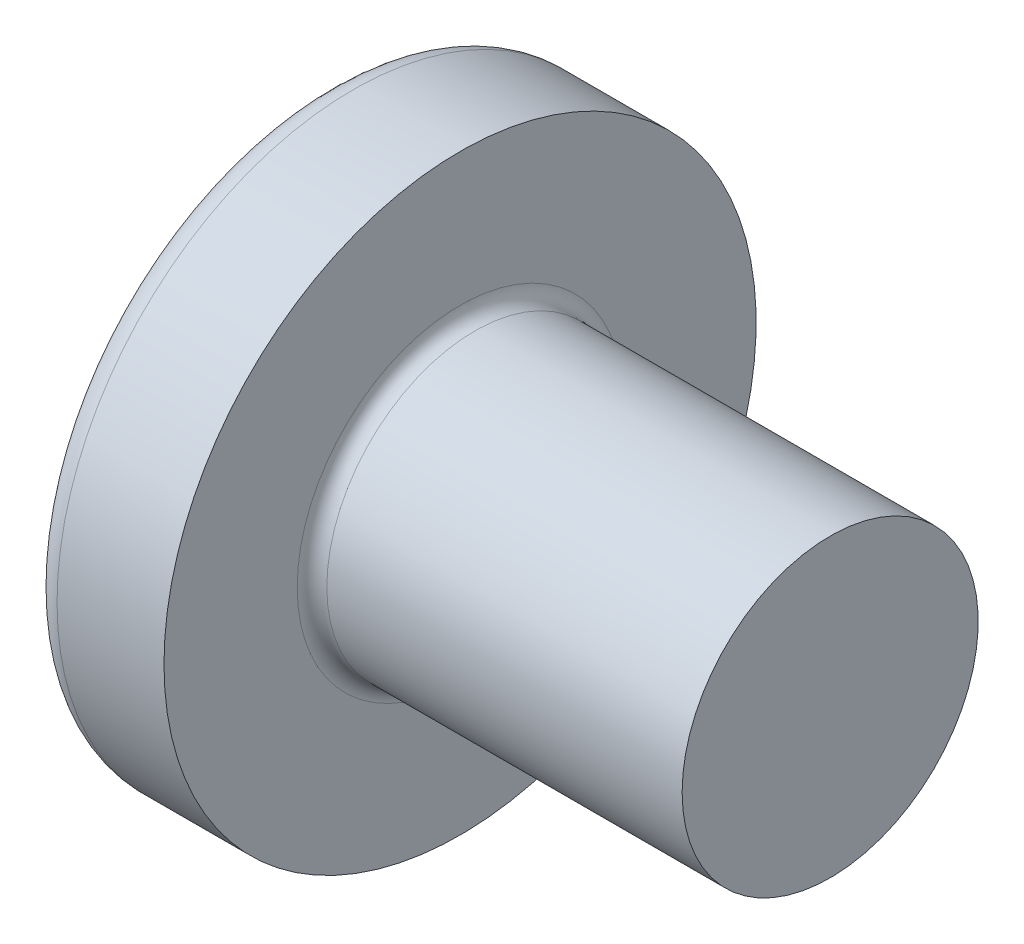
ISO-10303-21;
HEADER;
FILE_DESCRIPTION(('STEP AP214'),'2;1');
FILE_NAME('part.step','',(''),(''),'','','');
FILE_SCHEMA(('AUTOMOTIVE_DESIGN { 1 0 10303 214 1 1 1 1 }'));
ENDSEC;
DATA;
#1=APPLICATION_CONTEXT('core data for automotive mechanical design processes');
#2=APPLICATION_PROTOCOL_DEFINITION('international standard','automotive_design',2000,#1);
#3=PRODUCT_CONTEXT('',#1,'mechanical');
#4=PRODUCT('Part','Part','',(#3));
#5=PRODUCT_RELATED_PRODUCT_CATEGORY('part','',(#4));
#6=PRODUCT_DEFINITION_FORMATION('','',#4);
#7=PRODUCT_DEFINITION_CONTEXT('part definition',#1,'design');
#8=PRODUCT_DEFINITION('design','',#6,#7);
#9=PRODUCT_DEFINITION_SHAPE('','',#8);
#10=(LENGTH_UNIT() NAMED_UNIT(*) SI_UNIT(.MILLI.,.METRE.));
#11=(NAMED_UNIT(*) PLANE_ANGLE_UNIT() SI_UNIT($,.RADIAN.));
#12=(NAMED_UNIT(*) SI_UNIT($,.STERADIAN.) SOLID_ANGLE_UNIT());
#13=UNCERTAINTY_MEASURE_WITH_UNIT(LENGTH_MEASURE(1.E-05),#10,'distance_accuracy_value','');
#14=(GEOMETRIC_REPRESENTATION_CONTEXT(3) GLOBAL_UNCERTAINTY_ASSIGNED_CONTEXT((#13)) GLOBAL_UNIT_ASSIGNED_CONTEXT((#10,
#11,#12)) REPRESENTATION_CONTEXT('',''));
#15=CARTESIAN_POINT('',(0.,0.,0.));
#16=DIRECTION('',(0.,0.,1.));
#17=DIRECTION('',(1.,0.,0.));
#18=AXIS2_PLACEMENT_3D('',#15,#16,#17);
#19=CARTESIAN_POINT('',(13.,0.,0.));
#20=DIRECTION('',(-1.,0.,0.));
#21=DIRECTION('',(0.,1.,0.));
#22=AXIS2_PLACEMENT_3D('',#19,#20,#21);
#23=SPHERICAL_SURFACE('',#22,13.);
#24=CARTESIAN_POINT('',(2.53077790905606,0.,0.));
#25=DIRECTION('',(-1.,0.,0.));
#26=DIRECTION('',(0.,0.,1.));
#27=AXIS2_PLACEMENT_3D('',#24,#25,#26);
#28=CIRCLE('',#27,7.70684039087948);
#29=CARTESIAN_POINT('',(2.53077790905606,0.,7.70684039087948));
#30=VERTEX_POINT('',#29);
#31=EDGE_CURVE('E221',#30,#30,#28,.T.);
#32=ORIENTED_EDGE('',*,*,#31,.T.);
#33=EDGE_LOOP('',(#32));
#34=FACE_BOUND('',#33,.T.);
#35=CARTESIAN_POINT('',(0.192985393859263,0.,0.));
#36=DIRECTION('',(1.,0.,0.));
#37=DIRECTION('',(0.,0.,-1.));
#38=AXIS2_PLACEMENT_3D('',#35,#36,#37);
#39=CIRCLE('',#38,2.23167580040152);
#40=CARTESIAN_POINT('',(0.192985393859261,-1.07999999999999,-1.95294057208554));
#41=VERTEX_POINT('',#40);
#42=CARTESIAN_POINT('',(0.192985393859262,-1.95294057208555,-1.08));
#43=VERTEX_POINT('',#42);
#44=EDGE_CURVE('E348',#41,#43,#39,.F.);
#45=ORIENTED_EDGE('',*,*,#44,.F.);
#46=CARTESIAN_POINT('',(13.,-1.08,0.));
#47=DIRECTION('',(0.,1.,0.));
#48=DIRECTION('',(0.,0.,1.));
#49=AXIS2_PLACEMENT_3D('',#46,#47,#48);
#50=CIRCLE('',#49,12.9550607871982);
#51=CARTESIAN_POINT('',(0.695355040492038,-1.07999999999998,-4.0533088237211));
#52=VERTEX_POINT('',#51);
#53=EDGE_CURVE('E281',#52,#41,#50,.T.);
#54=ORIENTED_EDGE('',*,*,#53,.F.);
#55=CARTESIAN_POINT('',(12.1687962890756,0.,1.6671370072656));
#56=DIRECTION('',(0.446197753347441,0.,-0.89493439139844));
#57=DIRECTION('',(-0.89493439139844,0.,-0.446197753347441));
#58=AXIS2_PLACEMENT_3D('',#55,#56,#57);
#59=CIRCLE('',#58,12.8658367232742);
#60=CARTESIAN_POINT('',(0.695355040492038,1.08000000000001,-4.0533088237211));
#61=VERTEX_POINT('',#60);
#62=EDGE_CURVE('E255',#52,#61,#59,.T.);
#63=ORIENTED_EDGE('',*,*,#62,.T.);
#64=CARTESIAN_POINT('',(13.,1.08,0.));
#65=DIRECTION('',(0.,-1.,0.));
#66=DIRECTION('',(0.,0.,-1.));
#67=AXIS2_PLACEMENT_3D('',#64,#65,#66);
#68=CIRCLE('',#67,12.9550607871982);
#69=CARTESIAN_POINT('',(0.192985393859261,1.08000000000001,-1.95294057208553));
#70=VERTEX_POINT('',#69);
#71=EDGE_CURVE('E310',#70,#61,#68,.T.);
#72=ORIENTED_EDGE('',*,*,#71,.F.);
#73=CARTESIAN_POINT('',(0.192985393859262,1.95294057208555,-1.08));
#74=VERTEX_POINT('',#73);
#75=EDGE_CURVE('E363',#74,#70,#39,.F.);
#76=ORIENTED_EDGE('',*,*,#75,.F.);
#77=CARTESIAN_POINT('',(13.,0.,-1.08));
#78=DIRECTION('',(0.,0.,1.));
#79=DIRECTION('',(1.,0.,0.));
#80=AXIS2_PLACEMENT_3D('',#77,#78,#79);
#81=CIRCLE('',#80,12.9550607871982);
#82=CARTESIAN_POINT('',(0.695355040492042,4.05330882372111,-1.08));
#83=VERTEX_POINT('',#82);
#84=EDGE_CURVE('E249',#83,#74,#81,.T.);
#85=ORIENTED_EDGE('',*,*,#84,.F.);
#86=CARTESIAN_POINT('',(12.1687962890756,-1.66713700726547,0.));
#87=DIRECTION('',(0.446197753347431,0.894934391398445,0.));
#88=DIRECTION('',(-0.894934391398445,0.446197753347431,0.));
#89=AXIS2_PLACEMENT_3D('',#86,#87,#88);
#90=CIRCLE('',#89,12.8658367232742);
#91=CARTESIAN_POINT('',(0.695355040492042,4.05330882372111,1.08));
#92=VERTEX_POINT('',#91);
#93=EDGE_CURVE('E252',#83,#92,#90,.T.);
#94=ORIENTED_EDGE('',*,*,#93,.T.);
#95=CARTESIAN_POINT('',(13.,0.,1.08));
#96=DIRECTION('',(0.,0.,-1.));
#97=DIRECTION('',(0.,1.,0.));
#98=AXIS2_PLACEMENT_3D('',#95,#96,#97);
#99=CIRCLE('',#98,12.9550607871982);
#100=CARTESIAN_POINT('',(0.192985393859263,1.95294057208554,1.08));
#101=VERTEX_POINT('',#100);
#102=EDGE_CURVE('E245',#101,#92,#99,.T.);
#103=ORIENTED_EDGE('',*,*,#102,.F.);
#104=CARTESIAN_POINT('',(0.192985393859261,1.07999999999999,1.95294057208554));
#105=VERTEX_POINT('',#104);
#106=EDGE_CURVE('E362',#105,#101,#39,.F.);
#107=ORIENTED_EDGE('',*,*,#106,.F.);
#108=CARTESIAN_POINT('',(0.695355040492042,1.07999999999999,4.05330882372111));
#109=VERTEX_POINT('',#108);
#110=EDGE_CURVE('E265',#109,#105,#68,.T.);
#111=ORIENTED_EDGE('',*,*,#110,.F.);
#112=CARTESIAN_POINT('',(12.1687962890756,0.,-1.66713700726547));
#113=DIRECTION('',(0.446197753347431,0.,0.894934391398445));
#114=DIRECTION('',(0.894934391398445,0.,-0.446197753347431));
#115=AXIS2_PLACEMENT_3D('',#112,#113,#114);
#116=CIRCLE('',#115,12.8658367232742);
#117=CARTESIAN_POINT('',(0.695355040492042,-1.08000000000001,4.05330882372111));
#118=VERTEX_POINT('',#117);
#119=EDGE_CURVE('E55',#109,#118,#116,.T.);
#120=ORIENTED_EDGE('',*,*,#119,.T.);
#121=CARTESIAN_POINT('',(0.192985393859261,-1.08000000000001,1.95294057208553));
#122=VERTEX_POINT('',#121);
#123=EDGE_CURVE('E262',#122,#118,#50,.T.);
#124=ORIENTED_EDGE('',*,*,#123,.F.);
#125=CARTESIAN_POINT('',(0.192985393859263,-1.95294057208554,1.08));
#126=VERTEX_POINT('',#125);
#127=EDGE_CURVE('E398',#126,#122,#39,.F.);
#128=ORIENTED_EDGE('',*,*,#127,.F.);
#129=CARTESIAN_POINT('',(0.695355040492038,-4.0533088237211,1.08));
#130=VERTEX_POINT('',#129);
#131=EDGE_CURVE('E246',#130,#126,#99,.T.);
#132=ORIENTED_EDGE('',*,*,#131,.F.);
#133=CARTESIAN_POINT('',(12.1687962890756,1.6671370072656,0.));
#134=DIRECTION('',(0.446197753347441,-0.89493439139844,0.));
#135=DIRECTION('',(0.89493439139844,0.446197753347441,0.));
#136=AXIS2_PLACEMENT_3D('',#133,#134,#135);
#137=CIRCLE('',#136,12.8658367232742);
#138=CARTESIAN_POINT('',(0.695355040492038,-4.0533088237211,-1.08));
#139=VERTEX_POINT('',#138);
#140=EDGE_CURVE('E242',#130,#139,#137,.T.);
#141=ORIENTED_EDGE('',*,*,#140,.T.);
#142=EDGE_CURVE('E70',#43,#139,#81,.T.);
#143=ORIENTED_EDGE('',*,*,#142,.F.);
#144=EDGE_LOOP('',(#45,#54,#63,#72,#76,#85,#94,#103,#107,#111,#120,#124,#128,#132,#141,#143));
#145=FACE_BOUND('',#144,.T.);
#146=ADVANCED_FACE('F41',(#34,#145),#23,.T.);
#147=CARTESIAN_POINT('',(4.5,2.156383138963,-1.08));
#148=DIRECTION('',(0.,0.,1.));
#149=DIRECTION('',(1.,0.,0.));
#150=AXIS2_PLACEMENT_3D('',#147,#148,#149);
#151=PLANE('',#150);
#152=ORIENTED_EDGE('',*,*,#84,.T.);
#153=CARTESIAN_POINT('',(-3.43588792785571,2.23851936767459,-1.08));
#154=CARTESIAN_POINT('',(-2.7527913205408,2.18547211869447,-1.08));
#155=CARTESIAN_POINT('',(-2.06972018583939,2.13209339067246,-1.08));
#156=CARTESIAN_POINT('',(-0.703637932355171,2.02444570786586,-1.08));
#157=CARTESIAN_POINT('',(-0.0206268146116222,1.97017673990211,-1.08));
#158=CARTESIAN_POINT('',(1.34530575553301,1.86052289398031,-1.08));
#159=CARTESIAN_POINT('',(2.02822720797779,1.80513801656819,-1.08));
#160=CARTESIAN_POINT('',(3.05251420383416,1.72095758997849,-1.08));
#161=CARTESIAN_POINT('',(3.39392507761255,1.69271378676422,-1.08));
#162=CARTESIAN_POINT('',(4.07671251244001,1.63579565885855,-1.08));
#163=CARTESIAN_POINT('',(4.41808907331752,1.60712133211287,-1.08));
#164=CARTESIAN_POINT('',(5.47971211498772,1.51717277345393,-1.08));
#165=CARTESIAN_POINT('',(6.19988680931569,1.4550428860327,-1.08));
#166=CARTESIAN_POINT('',(7.27992860231561,1.3594298531641,-1.08));
#167=CARTESIAN_POINT('',(7.63990276767074,1.32715609306983,-1.08));
#168=CARTESIAN_POINT('',(8.35976072063592,1.26159920113472,-1.08));
#169=CARTESIAN_POINT('',(8.71964450791498,1.22831606565004,-1.08));
#170=CARTESIAN_POINT('',(9.43932436492648,1.16046898819133,-1.08));
#171=CARTESIAN_POINT('',(9.79912042388169,1.12590493148535,-1.08));
#172=CARTESIAN_POINT('',(10.5185446298634,1.05510254179503,-1.08));
#173=CARTESIAN_POINT('',(10.8781727785417,1.01886422564785,-1.08));
#174=CARTESIAN_POINT('',(11.5972182519752,0.944108377956584,-1.08));
#175=CARTESIAN_POINT('',(11.9566355614636,0.905590698029509,-1.08));
#176=CARTESIAN_POINT('',(12.4954907473183,0.845331334454827,-1.08));
#177=CARTESIAN_POINT('',(12.6750670374829,0.824830706169455,-1.08));
#178=CARTESIAN_POINT('',(13.0340978817974,0.782774474702269,-1.08));
#179=CARTESIAN_POINT('',(13.2135524345406,0.761218859534008,-1.08));
#180=CARTESIAN_POINT('',(13.3929293513437,0.739022214890856,-1.08));
#181=B_SPLINE_CURVE_WITH_KNOTS('',3,(#153,#154,#155,#156,#157,#158,#159,#160,#161,#162,#163,
#164,#165,#166,#167,#168,#169,#170,#171,#172,#173,#174,#175,#176,#177,#178,#179,#180),
.UNSPECIFIED.,.F.,.F.,(4,2,2,2,2,2,2,2,2,2,2,2,2,4),(0.,2.05546007613774,4.11095060892628,
6.16644013615303,7.19417128538829,8.22190734008792,10.3904503114318,11.4747033726806,
12.5589603485358,13.643314677002,14.7276581030614,15.8120721959877,16.3542975219795,
16.8965290100043),.UNSPECIFIED.);
#182=CARTESIAN_POINT('',(4.5,1.60013444747621,-1.08));
#183=VERTEX_POINT('',#182);
#184=EDGE_CURVE('E385',#74,#183,#181,.T.);
#185=ORIENTED_EDGE('',*,*,#184,.T.);
#186=DIRECTION('',(0.,1.,0.));
#187=VECTOR('',#186,1.);
#188=CARTESIAN_POINT('',(4.5,-2.15638313896293,-1.08));
#189=LINE('',#188,#187);
#190=CARTESIAN_POINT('',(4.5,2.156383138963,-1.08));
#191=VERTEX_POINT('',#190);
#192=EDGE_CURVE('E331',#183,#191,#189,.T.);
#193=ORIENTED_EDGE('',*,*,#192,.T.);
#194=DIRECTION('',(0.894934391398445,-0.446197753347431,0.));
#195=VECTOR('',#194,1.);
#196=CARTESIAN_POINT('',(0.,4.4,-1.08));
#197=LINE('',#196,#195);
#198=EDGE_CURVE('E222',#83,#191,#197,.T.);
#199=ORIENTED_EDGE('',*,*,#198,.F.);
#200=EDGE_LOOP('',(#152,#185,#193,#199));
#201=FACE_BOUND('',#200,.T.);
#202=ADVANCED_FACE('F176',(#201),#151,.T.);
#203=CARTESIAN_POINT('',(4.5,-2.15638313896293,-1.08));
#204=VERTEX_POINT('',#203);
#205=CARTESIAN_POINT('',(4.5,-1.60013444747621,-1.08));
#206=VERTEX_POINT('',#205);
#207=EDGE_CURVE('E230',#204,#206,#189,.T.);
#208=ORIENTED_EDGE('',*,*,#207,.T.);
#209=CARTESIAN_POINT('',(-3.43588792785571,-2.23851936767459,-1.08));
#210=CARTESIAN_POINT('',(-2.7527913205408,-2.18547211869447,-1.08));
#211=CARTESIAN_POINT('',(-2.06972018583939,-2.13209339067246,-1.08));
#212=CARTESIAN_POINT('',(-0.70363793235517,-2.02444570786586,-1.08));
#213=CARTESIAN_POINT('',(-0.0206268146116209,-1.97017673990211,-1.08));
#214=CARTESIAN_POINT('',(1.34530575553301,-1.86052289398031,-1.08));
#215=CARTESIAN_POINT('',(2.02822720797779,-1.80513801656819,-1.08));
#216=CARTESIAN_POINT('',(3.05251420383416,-1.72095758997849,-1.08));
#217=CARTESIAN_POINT('',(3.39392507761255,-1.69271378676422,-1.08));
#218=CARTESIAN_POINT('',(4.07671251244001,-1.63579565885855,-1.08));
#219=CARTESIAN_POINT('',(4.41808907331752,-1.60712133211287,-1.08));
#220=CARTESIAN_POINT('',(5.47971211498773,-1.51717277345393,-1.08));
#221=CARTESIAN_POINT('',(6.19988680931569,-1.4550428860327,-1.08));
#222=CARTESIAN_POINT('',(7.27992860231561,-1.3594298531641,-1.08));
#223=CARTESIAN_POINT('',(7.63990276767074,-1.32715609306983,-1.08));
#224=CARTESIAN_POINT('',(8.35976072063592,-1.26159920113472,-1.08));
#225=CARTESIAN_POINT('',(8.71964450791498,-1.22831606565004,-1.08));
#226=CARTESIAN_POINT('',(9.43932436492649,-1.16046898819133,-1.08));
#227=CARTESIAN_POINT('',(9.79912042388169,-1.12590493148535,-1.08));
#228=CARTESIAN_POINT('',(10.5185446298634,-1.05510254179503,-1.08));
#229=CARTESIAN_POINT('',(10.8781727785417,-1.01886422564785,-1.08));
#230=CARTESIAN_POINT('',(11.5972182519753,-0.944108377956583,-1.08));
#231=CARTESIAN_POINT('',(11.9566355614636,-0.905590698029509,-1.08));
#232=CARTESIAN_POINT('',(12.4954907473183,-0.845331334454827,-1.08));
#233=CARTESIAN_POINT('',(12.6750670374829,-0.824830706169454,-1.08));
#234=CARTESIAN_POINT('',(13.0340978817974,-0.782774474702268,-1.08));
#235=CARTESIAN_POINT('',(13.2135524345406,-0.761218859534007,-1.08));
#236=CARTESIAN_POINT('',(13.3929293513437,-0.739022214890855,-1.08));
#237=B_SPLINE_CURVE_WITH_KNOTS('',3,(#209,#210,#211,#212,#213,#214,#215,#216,#217,#218,#219,
#220,#221,#222,#223,#224,#225,#226,#227,#228,#229,#230,#231,#232,#233,#234,#235,#236),
.UNSPECIFIED.,.F.,.F.,(4,2,2,2,2,2,2,2,2,2,2,2,2,4),(0.,2.05546007613774,4.11095060892628,
6.16644013615303,7.19417128538829,8.22190734008792,10.3904503114318,11.4747033726806,
12.5589603485358,13.643314677002,14.7276581030614,15.8120721959877,16.3542975219795,
16.8965290100043),.UNSPECIFIED.);
#238=EDGE_CURVE('E361',#206,#43,#237,.F.);
#239=ORIENTED_EDGE('',*,*,#238,.T.);
#240=ORIENTED_EDGE('',*,*,#142,.T.);
#241=DIRECTION('',(0.89493439139844,0.446197753347441,0.));
#242=VECTOR('',#241,1.);
#243=CARTESIAN_POINT('',(0.,-4.4,-1.08));
#244=LINE('',#243,#242);
#245=EDGE_CURVE('E313',#139,#204,#244,.T.);
#246=ORIENTED_EDGE('',*,*,#245,.T.);
#247=EDGE_LOOP('',(#208,#239,#240,#246));
#248=FACE_BOUND('',#247,.T.);
#249=ADVANCED_FACE('F183',(#248),#151,.T.);
#250=CARTESIAN_POINT('',(4.5,-2.15638313896293,1.08));
#251=DIRECTION('',(0.,0.,-1.));
#252=DIRECTION('',(0.,1.,0.));
#253=AXIS2_PLACEMENT_3D('',#250,#251,#252);
#254=PLANE('',#253);
#255=DIRECTION('',(0.,-1.,0.));
#256=VECTOR('',#255,1.);
#257=CARTESIAN_POINT('',(4.5,2.156383138963,1.08));
#258=LINE('',#257,#256);
#259=CARTESIAN_POINT('',(4.5,2.156383138963,1.08));
#260=VERTEX_POINT('',#259);
#261=CARTESIAN_POINT('',(4.5,1.60013444747621,1.08));
#262=VERTEX_POINT('',#261);
#263=EDGE_CURVE('E321',#260,#262,#258,.T.);
#264=ORIENTED_EDGE('',*,*,#263,.T.);
#265=CARTESIAN_POINT('',(-3.43588792785571,2.23851936767459,1.08));
#266=CARTESIAN_POINT('',(-2.7527913205408,2.18547211869447,1.08));
#267=CARTESIAN_POINT('',(-2.06972018583939,2.13209339067246,1.08));
#268=CARTESIAN_POINT('',(-0.70363793235517,2.02444570786586,1.08));
#269=CARTESIAN_POINT('',(-0.0206268146116213,1.97017673990211,1.08));
#270=CARTESIAN_POINT('',(1.34530575553301,1.86052289398031,1.08));
#271=CARTESIAN_POINT('',(2.02822720797779,1.80513801656819,1.08));
#272=CARTESIAN_POINT('',(3.05251420383416,1.72095758997849,1.08));
#273=CARTESIAN_POINT('',(3.39392507761255,1.69271378676422,1.08));
#274=CARTESIAN_POINT('',(4.07671251244001,1.63579565885855,1.08));
#275=CARTESIAN_POINT('',(4.41808907331752,1.60712133211287,1.08));
#276=CARTESIAN_POINT('',(5.47971211498773,1.51717277345393,1.08));
#277=CARTESIAN_POINT('',(6.19988680931569,1.4550428860327,1.08));
#278=CARTESIAN_POINT('',(7.27992860231561,1.35942985316409,1.08));
#279=CARTESIAN_POINT('',(7.63990276767074,1.32715609306983,1.08));
#280=CARTESIAN_POINT('',(8.35976072063593,1.26159920113472,1.08));
#281=CARTESIAN_POINT('',(8.71964450791499,1.22831606565004,1.08));
#282=CARTESIAN_POINT('',(9.43932436492649,1.16046898819133,1.08));
#283=CARTESIAN_POINT('',(9.7991204238817,1.12590493148534,1.08));
#284=CARTESIAN_POINT('',(10.5185446298634,1.05510254179503,1.08));
#285=CARTESIAN_POINT('',(10.8781727785417,1.01886422564785,1.08));
#286=CARTESIAN_POINT('',(11.5972182519753,0.944108377956582,1.08));
#287=CARTESIAN_POINT('',(11.9566355614636,0.905590698029507,1.08));
#288=CARTESIAN_POINT('',(12.4954907473183,0.845331334454825,1.08));
#289=CARTESIAN_POINT('',(12.6750670374829,0.824830706169453,1.08));
#290=CARTESIAN_POINT('',(13.0340978817974,0.782774474702267,1.08));
#291=CARTESIAN_POINT('',(13.2135524345406,0.761218859534006,1.08));
#292=CARTESIAN_POINT('',(13.3929293513437,0.739022214890854,1.08));
#293=B_SPLINE_CURVE_WITH_KNOTS('',3,(#265,#266,#267,#268,#269,#270,#271,#272,#273,#274,#275,
#276,#277,#278,#279,#280,#281,#282,#283,#284,#285,#286,#287,#288,#289,#290,#291,#292),
.UNSPECIFIED.,.F.,.F.,(4,2,2,2,2,2,2,2,2,2,2,2,2,4),(0.,2.05546007613774,4.11095060892628,
6.16644013615303,7.19417128538829,8.22190734008792,10.3904503114318,11.4747033726806,
12.5589603485358,13.643314677002,14.7276581030614,15.8120721959877,16.3542975219795,
16.8965290100043),.UNSPECIFIED.);
#294=EDGE_CURVE('E286',#262,#101,#293,.F.);
#295=ORIENTED_EDGE('',*,*,#294,.T.);
#296=ORIENTED_EDGE('',*,*,#102,.T.);
#297=DIRECTION('',(0.894934391398445,-0.446197753347431,0.));
#298=VECTOR('',#297,1.);
#299=CARTESIAN_POINT('',(0.,4.4,1.08));
#300=LINE('',#299,#298);
#301=EDGE_CURVE('E227',#92,#260,#300,.T.);
#302=ORIENTED_EDGE('',*,*,#301,.T.);
#303=EDGE_LOOP('',(#264,#295,#296,#302));
#304=FACE_BOUND('',#303,.T.);
#305=ADVANCED_FACE('F381',(#304),#254,.T.);
#306=ORIENTED_EDGE('',*,*,#131,.T.);
#307=CARTESIAN_POINT('',(-3.43588792785571,-2.23851936767459,1.08));
#308=CARTESIAN_POINT('',(-2.7527913205408,-2.18547211869447,1.08));
#309=CARTESIAN_POINT('',(-2.06972018583939,-2.13209339067246,1.08));
#310=CARTESIAN_POINT('',(-0.703637932355172,-2.02444570786586,1.08));
#311=CARTESIAN_POINT('',(-0.0206268146116229,-1.97017673990211,1.08));
#312=CARTESIAN_POINT('',(1.34530575553301,-1.86052289398031,1.08));
#313=CARTESIAN_POINT('',(2.02822720797779,-1.80513801656819,1.08));
#314=CARTESIAN_POINT('',(3.05251420383416,-1.72095758997849,1.08));
#315=CARTESIAN_POINT('',(3.39392507761255,-1.69271378676422,1.08));
#316=CARTESIAN_POINT('',(4.07671251244001,-1.63579565885855,1.08));
#317=CARTESIAN_POINT('',(4.41808907331752,-1.60712133211287,1.08));
#318=CARTESIAN_POINT('',(5.47971211498772,-1.51717277345393,1.08));
#319=CARTESIAN_POINT('',(6.19988680931569,-1.4550428860327,1.08));
#320=CARTESIAN_POINT('',(7.27992860231561,-1.3594298531641,1.08));
#321=CARTESIAN_POINT('',(7.63990276767074,-1.32715609306983,1.08));
#322=CARTESIAN_POINT('',(8.35976072063592,-1.26159920113472,1.08));
#323=CARTESIAN_POINT('',(8.71964450791498,-1.22831606565004,1.08));
#324=CARTESIAN_POINT('',(9.43932436492648,-1.16046898819133,1.08));
#325=CARTESIAN_POINT('',(9.79912042388169,-1.12590493148535,1.08));
#326=CARTESIAN_POINT('',(10.5185446298634,-1.05510254179503,1.08));
#327=CARTESIAN_POINT('',(10.8781727785417,-1.01886422564785,1.08));
#328=CARTESIAN_POINT('',(11.5972182519752,-0.944108377956584,1.08));
#329=CARTESIAN_POINT('',(11.9566355614636,-0.905590698029509,1.08));
#330=CARTESIAN_POINT('',(12.4954907473183,-0.845331334454827,1.08));
#331=CARTESIAN_POINT('',(12.6750670374829,-0.824830706169454,1.08));
#332=CARTESIAN_POINT('',(13.0340978817974,-0.782774474702267,1.08));
#333=CARTESIAN_POINT('',(13.2135524345406,-0.761218859534007,1.08));
#334=CARTESIAN_POINT('',(13.3929293513437,-0.739022214890855,1.08));
#335=B_SPLINE_CURVE_WITH_KNOTS('',3,(#307,#308,#309,#310,#311,#312,#313,#314,#315,#316,#317,
#318,#319,#320,#321,#322,#323,#324,#325,#326,#327,#328,#329,#330,#331,#332,#333,#334),
.UNSPECIFIED.,.F.,.F.,(4,2,2,2,2,2,2,2,2,2,2,2,2,4),(0.,2.05546007613774,4.11095060892628,
6.16644013615303,7.19417128538829,8.22190734008792,10.3904503114318,11.4747033726806,
12.5589603485358,13.643314677002,14.7276581030614,15.8120721959877,16.3542975219795,
16.8965290100043),.UNSPECIFIED.);
#336=CARTESIAN_POINT('',(4.5,-1.60013444747621,1.08));
#337=VERTEX_POINT('',#336);
#338=EDGE_CURVE('E399',#126,#337,#335,.T.);
#339=ORIENTED_EDGE('',*,*,#338,.T.);
#340=CARTESIAN_POINT('',(4.5,-2.15638313896293,1.08));
#341=VERTEX_POINT('',#340);
#342=EDGE_CURVE('E323',#337,#341,#258,.T.);
#343=ORIENTED_EDGE('',*,*,#342,.T.);
#344=DIRECTION('',(0.89493439139844,0.446197753347441,0.));
#345=VECTOR('',#344,1.);
#346=CARTESIAN_POINT('',(0.,-4.4,1.08));
#347=LINE('',#346,#345);
#348=EDGE_CURVE('E315',#130,#341,#347,.T.);
#349=ORIENTED_EDGE('',*,*,#348,.F.);
#350=EDGE_LOOP('',(#306,#339,#343,#349));
#351=FACE_BOUND('',#350,.T.);
#352=ADVANCED_FACE('F428',(#351),#254,.T.);
#353=CARTESIAN_POINT('',(4.5,2.156383138963,-1.08));
#354=DIRECTION('',(-1.,0.,0.));
#355=DIRECTION('',(0.,0.,1.));
#356=AXIS2_PLACEMENT_3D('',#353,#354,#355);
#357=PLANE('',#356);
#358=ORIENTED_EDGE('',*,*,#342,.F.);
#359=CARTESIAN_POINT('',(4.5,0.,0.));
#360=DIRECTION('',(-1.,0.,0.));
#361=DIRECTION('',(0.,0.,1.));
#362=AXIS2_PLACEMENT_3D('',#359,#360,#361);
#363=CIRCLE('',#362,1.9305);
#364=EDGE_CURVE('E356',#206,#337,#363,.T.);
#365=ORIENTED_EDGE('',*,*,#364,.F.);
#366=ORIENTED_EDGE('',*,*,#207,.F.);
#367=DIRECTION('',(0.,0.,1.));
#368=VECTOR('',#367,1.);
#369=CARTESIAN_POINT('',(4.5,-2.15638313896293,-1.08));
#370=LINE('',#369,#368);
#371=EDGE_CURVE('E318',#204,#341,#370,.T.);
#372=ORIENTED_EDGE('',*,*,#371,.T.);
#373=EDGE_LOOP('',(#358,#365,#366,#372));
#374=FACE_BOUND('',#373,.T.);
#375=ADVANCED_FACE('F422',(#374),#357,.T.);
#376=DIRECTION('',(0.,0.,-1.));
#377=VECTOR('',#376,1.);
#378=CARTESIAN_POINT('',(4.5,-1.08000000000001,2.156383138963));
#379=LINE('',#378,#377);
#380=CARTESIAN_POINT('',(4.5,-1.07999999999999,-1.60013444747621));
#381=VERTEX_POINT('',#380);
#382=CARTESIAN_POINT('',(4.5,-1.07999999999999,-2.15638313896294));
#383=VERTEX_POINT('',#382);
#384=EDGE_CURVE('E304',#381,#383,#379,.T.);
#385=ORIENTED_EDGE('',*,*,#384,.F.);
#386=CARTESIAN_POINT('',(4.5,1.08000000000001,-1.60013444747621));
#387=VERTEX_POINT('',#386);
#388=EDGE_CURVE('E62',#387,#381,#363,.T.);
#389=ORIENTED_EDGE('',*,*,#388,.F.);
#390=DIRECTION('',(0.,0.,1.));
#391=VECTOR('',#390,1.);
#392=CARTESIAN_POINT('',(4.5,1.08000000000001,-2.15638313896293));
#393=LINE('',#392,#391);
#394=CARTESIAN_POINT('',(4.5,1.08000000000001,-2.15638313896293));
#395=VERTEX_POINT('',#394);
#396=EDGE_CURVE('E307',#395,#387,#393,.T.);
#397=ORIENTED_EDGE('',*,*,#396,.F.);
#398=DIRECTION('',(0.,-1.,0.));
#399=VECTOR('',#398,1.);
#400=CARTESIAN_POINT('',(4.5,1.08000000000001,-2.15638313896293));
#401=LINE('',#400,#399);
#402=EDGE_CURVE('E298',#395,#383,#401,.T.);
#403=ORIENTED_EDGE('',*,*,#402,.T.);
#404=EDGE_LOOP('',(#385,#389,#397,#403));
#405=FACE_BOUND('',#404,.T.);
#406=ADVANCED_FACE('F351',(#405),#357,.T.);
#407=ORIENTED_EDGE('',*,*,#192,.F.);
#408=EDGE_CURVE('E355',#262,#183,#363,.T.);
#409=ORIENTED_EDGE('',*,*,#408,.F.);
#410=ORIENTED_EDGE('',*,*,#263,.F.);
#411=DIRECTION('',(0.,0.,-1.));
#412=VECTOR('',#411,1.);
#413=CARTESIAN_POINT('',(4.5,2.156383138963,1.08));
#414=LINE('',#413,#412);
#415=EDGE_CURVE('E324',#260,#191,#414,.T.);
#416=ORIENTED_EDGE('',*,*,#415,.T.);
#417=EDGE_LOOP('',(#407,#409,#410,#416));
#418=FACE_BOUND('',#417,.T.);
#419=ADVANCED_FACE('F423',(#418),#357,.T.);
#420=CARTESIAN_POINT('',(4.5,1.07999999999999,2.156383138963));
#421=DIRECTION('',(0.,-1.,0.));
#422=DIRECTION('',(1.,0.,0.));
#423=AXIS2_PLACEMENT_3D('',#420,#421,#422);
#424=PLANE('',#423);
#425=ORIENTED_EDGE('',*,*,#110,.T.);
#426=CARTESIAN_POINT('',(-3.43588792785571,1.07999999999999,2.2385193676746));
#427=CARTESIAN_POINT('',(-2.7527913205408,1.07999999999999,2.18547211869447));
#428=CARTESIAN_POINT('',(-2.06972018583939,1.07999999999999,2.13209339067246));
#429=CARTESIAN_POINT('',(-0.703637932355171,1.07999999999999,2.02444570786586));
#430=CARTESIAN_POINT('',(-0.0206268146116218,1.07999999999999,1.97017673990211));
#431=CARTESIAN_POINT('',(1.34530575553301,1.07999999999999,1.86052289398031));
#432=CARTESIAN_POINT('',(2.02822720797779,1.07999999999999,1.80513801656819));
#433=CARTESIAN_POINT('',(3.05251420383416,1.07999999999999,1.72095758997849));
#434=CARTESIAN_POINT('',(3.39392507761255,1.07999999999999,1.69271378676422));
#435=CARTESIAN_POINT('',(4.07671251244001,1.07999999999999,1.63579565885856));
#436=CARTESIAN_POINT('',(4.41808907331752,1.07999999999999,1.60712133211288));
#437=CARTESIAN_POINT('',(5.47971211498773,1.07999999999999,1.51717277345393));
#438=CARTESIAN_POINT('',(6.19988680931569,1.07999999999999,1.4550428860327));
#439=CARTESIAN_POINT('',(7.27992860231561,1.07999999999999,1.3594298531641));
#440=CARTESIAN_POINT('',(7.63990276767074,1.07999999999999,1.32715609306984));
#441=CARTESIAN_POINT('',(8.35976072063592,1.07999999999999,1.26159920113472));
#442=CARTESIAN_POINT('',(8.71964450791498,1.08,1.22831606565004));
#443=CARTESIAN_POINT('',(9.43932436492648,1.08,1.16046898819134));
#444=CARTESIAN_POINT('',(9.79912042388169,1.08,1.12590493148535));
#445=CARTESIAN_POINT('',(10.5185446298634,1.08,1.05510254179504));
#446=CARTESIAN_POINT('',(10.8781727785417,1.08,1.01886422564786));
#447=CARTESIAN_POINT('',(11.5972182519752,1.08,0.944108377956588));
#448=CARTESIAN_POINT('',(11.9566355614636,1.08,0.905590698029513));
#449=CARTESIAN_POINT('',(12.4954907473183,1.08,0.845331334454831));
#450=CARTESIAN_POINT('',(12.6750670374829,1.08,0.824830706169459));
#451=CARTESIAN_POINT('',(13.0340978817974,1.08,0.782774474702273));
#452=CARTESIAN_POINT('',(13.2135524345406,1.08,0.761218859534012));
#453=CARTESIAN_POINT('',(13.3929293513437,1.08,0.73902221489086));
#454=B_SPLINE_CURVE_WITH_KNOTS('',3,(#426,#427,#428,#429,#430,#431,#432,#433,#434,#435,#436,
#437,#438,#439,#440,#441,#442,#443,#444,#445,#446,#447,#448,#449,#450,#451,#452,#453),
.UNSPECIFIED.,.F.,.F.,(4,2,2,2,2,2,2,2,2,2,2,2,2,4),(0.,2.05546007613774,4.11095060892628,
6.16644013615303,7.19417128538829,8.22190734008792,10.3904503114318,11.4747033726806,
12.5589603485358,13.643314677002,14.7276581030614,15.8120721959877,16.3542975219795,
16.8965290100043),.UNSPECIFIED.);
#455=CARTESIAN_POINT('',(4.5,1.07999999999999,1.60013444747622));
#456=VERTEX_POINT('',#455);
#457=EDGE_CURVE('E446',#105,#456,#454,.T.);
#458=ORIENTED_EDGE('',*,*,#457,.T.);
#459=CARTESIAN_POINT('',(4.5,1.07999999999999,2.156383138963));
#460=VERTEX_POINT('',#459);
#461=EDGE_CURVE('E279',#456,#460,#393,.T.);
#462=ORIENTED_EDGE('',*,*,#461,.T.);
#463=DIRECTION('',(0.894934391398445,0.,-0.446197753347431));
#464=VECTOR('',#463,1.);
#465=CARTESIAN_POINT('',(0.,1.07999999999998,4.4));
#466=LINE('',#465,#464);
#467=EDGE_CURVE('E272',#109,#460,#466,.T.);
#468=ORIENTED_EDGE('',*,*,#467,.F.);
#469=EDGE_LOOP('',(#425,#458,#462,#468));
#470=FACE_BOUND('',#469,.T.);
#471=ADVANCED_FACE('F276',(#470),#424,.T.);
#472=CARTESIAN_POINT('',(4.5,-1.07999999999999,-2.15638313896294));
#473=DIRECTION('',(0.,1.,0.));
#474=DIRECTION('',(0.,0.,1.));
#475=AXIS2_PLACEMENT_3D('',#472,#473,#474);
#476=PLANE('',#475);
#477=CARTESIAN_POINT('',(4.5,-1.08000000000001,2.156383138963));
#478=VERTEX_POINT('',#477);
#479=CARTESIAN_POINT('',(4.5,-1.08000000000001,1.60013444747621));
#480=VERTEX_POINT('',#479);
#481=EDGE_CURVE('E301',#478,#480,#379,.T.);
#482=ORIENTED_EDGE('',*,*,#481,.T.);
#483=CARTESIAN_POINT('',(-3.43588793513887,-1.08000000000001,2.23851936824005));
#484=CARTESIAN_POINT('',(-2.75279132691756,-1.08000000000001,2.18547211919204));
#485=CARTESIAN_POINT('',(-2.0697201913098,-1.08000000000001,2.13209339110156));
#486=CARTESIAN_POINT('',(-0.703637936012948,-1.08000000000001,2.0244457081561));
#487=CARTESIAN_POINT('',(-0.0206268173631189,-1.08000000000001,1.97017674012196));
#488=CARTESIAN_POINT('',(1.3453057552426,-1.08000000000001,1.86052289400465));
#489=CARTESIAN_POINT('',(2.0282272092421,-1.08000000000001,1.80513801646633));
#490=CARTESIAN_POINT('',(3.05251420743007,-1.08000000000001,1.72095758968193));
#491=CARTESIAN_POINT('',(3.39392508198555,-1.08000000000001,1.69271378640186));
#492=CARTESIAN_POINT('',(4.07671251836703,-1.08000000000001,1.63579565836229));
#493=CARTESIAN_POINT('',(4.41808908002146,-1.08000000000001,1.60712133154852));
#494=CARTESIAN_POINT('',(5.47971212246801,-1.08000000000001,1.5171727728123));
#495=CARTESIAN_POINT('',(6.1998868167954,-1.08,1.45504288538199));
#496=CARTESIAN_POINT('',(7.2799286097941,-1.08,1.35942985249637));
#497=CARTESIAN_POINT('',(7.63990277514874,-1.08,1.32715609239587));
#498=CARTESIAN_POINT('',(8.35976072811279,-1.08,1.26159920044671));
#499=CARTESIAN_POINT('',(8.71964451539121,-1.08,1.22831606495422));
#500=CARTESIAN_POINT('',(9.43932437240132,-1.08,1.16046898747764));
#501=CARTESIAN_POINT('',(9.79912043135579,-1.08,1.12590493076159));
#502=CARTESIAN_POINT('',(10.5185446373356,-1.08,1.05510254104782));
#503=CARTESIAN_POINT('',(10.8781727860128,-1.08,1.01886422488724));
#504=CARTESIAN_POINT('',(11.5972182594435,-1.08,0.944108377163901));
#505=CARTESIAN_POINT('',(11.9566355689302,-1.08,0.905590697218146));
#506=CARTESIAN_POINT('',(12.4954907547814,-1.08,0.845331333608451));
#507=CARTESIAN_POINT('',(12.6750670449448,-1.08,0.82483070531024));
#508=CARTESIAN_POINT('',(13.0340978892563,-1.08,0.782774473813944));
#509=CARTESIAN_POINT('',(13.2135524419977,-1.08,0.761218858629414));
#510=CARTESIAN_POINT('',(13.3929293587987,-1.08,0.739022213967728));
#511=B_SPLINE_CURVE_WITH_KNOTS('',3,(#483,#484,#485,#486,#487,#488,#489,#490,#491,#492,#493,
#494,#495,#496,#497,#498,#499,#500,#501,#502,#503,#504,#505,#506,#507,#508,#509,#510),
.UNSPECIFIED.,.F.,.F.,(4,2,2,2,2,2,2,2,2,2,2,2,2,4),(0.,2.05546007886453,4.1109506143801,
6.16644014628634,7.19417129786123,8.22190735490053,10.390450326245,11.474703387494,
12.5589603633494,13.6433146918163,14.7276581178763,15.8120722108036,16.3542975367959,
16.8965290248213),.UNSPECIFIED.);
#512=EDGE_CURVE('E391',#480,#122,#511,.F.);
#513=ORIENTED_EDGE('',*,*,#512,.T.);
#514=ORIENTED_EDGE('',*,*,#123,.T.);
#515=DIRECTION('',(0.894934391398445,0.,-0.446197753347431));
#516=VECTOR('',#515,1.);
#517=CARTESIAN_POINT('',(0.,-1.08000000000002,4.4));
#518=LINE('',#517,#516);
#519=EDGE_CURVE('E274',#118,#478,#518,.T.);
#520=ORIENTED_EDGE('',*,*,#519,.T.);
#521=EDGE_LOOP('',(#482,#513,#514,#520));
#522=FACE_BOUND('',#521,.T.);
#523=ADVANCED_FACE('F212',(#522),#476,.T.);
#524=ORIENTED_EDGE('',*,*,#396,.T.);
#525=CARTESIAN_POINT('',(-3.43588793513887,1.08000000000001,-2.23851936824005));
#526=CARTESIAN_POINT('',(-2.75279132691756,1.08000000000001,-2.18547211919204));
#527=CARTESIAN_POINT('',(-2.0697201913098,1.08000000000001,-2.13209339110156));
#528=CARTESIAN_POINT('',(-0.703637936012947,1.08000000000001,-2.0244457081561));
#529=CARTESIAN_POINT('',(-0.020626817363118,1.08000000000001,-1.97017674012196));
#530=CARTESIAN_POINT('',(1.3453057552426,1.08000000000001,-1.86052289400465));
#531=CARTESIAN_POINT('',(2.0282272092421,1.08000000000001,-1.80513801646633));
#532=CARTESIAN_POINT('',(3.05251420743007,1.08000000000001,-1.72095758968193));
#533=CARTESIAN_POINT('',(3.39392508198555,1.08000000000001,-1.69271378640186));
#534=CARTESIAN_POINT('',(4.07671251836703,1.08000000000001,-1.63579565836229));
#535=CARTESIAN_POINT('',(4.41808908002146,1.08000000000001,-1.60712133154852));
#536=CARTESIAN_POINT('',(5.47971212246801,1.08,-1.5171727728123));
#537=CARTESIAN_POINT('',(6.1998868167954,1.08,-1.45504288538199));
#538=CARTESIAN_POINT('',(7.2799286097941,1.08,-1.35942985249637));
#539=CARTESIAN_POINT('',(7.63990277514874,1.08,-1.32715609239587));
#540=CARTESIAN_POINT('',(8.35976072811279,1.08,-1.26159920044671));
#541=CARTESIAN_POINT('',(8.71964451539121,1.08,-1.22831606495422));
#542=CARTESIAN_POINT('',(9.43932437240133,1.08,-1.16046898747764));
#543=CARTESIAN_POINT('',(9.79912043135579,1.08,-1.12590493076159));
#544=CARTESIAN_POINT('',(10.5185446373356,1.08,-1.05510254104782));
#545=CARTESIAN_POINT('',(10.8781727860128,1.08,-1.01886422488724));
#546=CARTESIAN_POINT('',(11.5972182594435,1.08,-0.944108377163902));
#547=CARTESIAN_POINT('',(11.9566355689302,1.08,-0.905590697218147));
#548=CARTESIAN_POINT('',(12.4954907547814,1.08,-0.845331333608452));
#549=CARTESIAN_POINT('',(12.6750670449448,1.08,-0.824830705310241));
#550=CARTESIAN_POINT('',(13.0340978892563,1.08,-0.782774473813946));
#551=CARTESIAN_POINT('',(13.2135524419977,1.08,-0.761218858629415));
#552=CARTESIAN_POINT('',(13.3929293587987,1.08,-0.739022213967729));
#553=B_SPLINE_CURVE_WITH_KNOTS('',3,(#525,#526,#527,#528,#529,#530,#531,#532,#533,#534,#535,
#536,#537,#538,#539,#540,#541,#542,#543,#544,#545,#546,#547,#548,#549,#550,#551,#552),
.UNSPECIFIED.,.F.,.F.,(4,2,2,2,2,2,2,2,2,2,2,2,2,4),(0.,2.05546007886454,4.1109506143801,
6.16644014628634,7.19417129786123,8.22190735490053,10.390450326245,11.474703387494,
12.5589603633494,13.6433146918163,14.7276581178763,15.8120722108036,16.3542975367959,
16.8965290248213),.UNSPECIFIED.);
#554=EDGE_CURVE('E340',#387,#70,#553,.F.);
#555=ORIENTED_EDGE('',*,*,#554,.T.);
#556=ORIENTED_EDGE('',*,*,#71,.T.);
#557=DIRECTION('',(0.89493439139844,0.,0.446197753347441));
#558=VECTOR('',#557,1.);
#559=CARTESIAN_POINT('',(0.,1.08000000000002,-4.4));
#560=LINE('',#559,#558);
#561=EDGE_CURVE('E283',#61,#395,#560,.T.);
#562=ORIENTED_EDGE('',*,*,#561,.T.);
#563=EDGE_LOOP('',(#524,#555,#556,#562));
#564=FACE_BOUND('',#563,.T.);
#565=ADVANCED_FACE('F210',(#564),#424,.T.);
#566=ORIENTED_EDGE('',*,*,#53,.T.);
#567=CARTESIAN_POINT('',(-3.43588792785571,-1.07999999999999,-2.2385193676746));
#568=CARTESIAN_POINT('',(-2.7527913205408,-1.07999999999999,-2.18547211869447));
#569=CARTESIAN_POINT('',(-2.06972018583939,-1.07999999999999,-2.13209339067246));
#570=CARTESIAN_POINT('',(-0.703637932355171,-1.07999999999999,-2.02444570786586));
#571=CARTESIAN_POINT('',(-0.0206268146116215,-1.07999999999999,-1.97017673990211));
#572=CARTESIAN_POINT('',(1.34530575553301,-1.07999999999999,-1.86052289398031));
#573=CARTESIAN_POINT('',(2.02822720797779,-1.07999999999999,-1.80513801656819));
#574=CARTESIAN_POINT('',(3.05251420383416,-1.07999999999999,-1.72095758997849));
#575=CARTESIAN_POINT('',(3.39392507761255,-1.07999999999999,-1.69271378676422));
#576=CARTESIAN_POINT('',(4.07671251244001,-1.07999999999999,-1.63579565885856));
#577=CARTESIAN_POINT('',(4.41808907331752,-1.07999999999999,-1.60712133211288));
#578=CARTESIAN_POINT('',(5.47971211498773,-1.07999999999999,-1.51717277345393));
#579=CARTESIAN_POINT('',(6.19988680931569,-1.07999999999999,-1.4550428860327));
#580=CARTESIAN_POINT('',(7.27992860231561,-1.07999999999999,-1.3594298531641));
#581=CARTESIAN_POINT('',(7.63990276767074,-1.07999999999999,-1.32715609306984));
#582=CARTESIAN_POINT('',(8.35976072063592,-1.08,-1.26159920113472));
#583=CARTESIAN_POINT('',(8.71964450791498,-1.08,-1.22831606565004));
#584=CARTESIAN_POINT('',(9.43932436492648,-1.08,-1.16046898819134));
#585=CARTESIAN_POINT('',(9.79912042388169,-1.08,-1.12590493148535));
#586=CARTESIAN_POINT('',(10.5185446298634,-1.08,-1.05510254179504));
#587=CARTESIAN_POINT('',(10.8781727785417,-1.08,-1.01886422564785));
#588=CARTESIAN_POINT('',(11.5972182519752,-1.08,-0.944108377956587));
#589=CARTESIAN_POINT('',(11.9566355614636,-1.08,-0.905590698029512));
#590=CARTESIAN_POINT('',(12.4954907473183,-1.08,-0.84533133445483));
#591=CARTESIAN_POINT('',(12.6750670374829,-1.08,-0.824830706169458));
#592=CARTESIAN_POINT('',(13.0340978817974,-1.08,-0.782774474702271));
#593=CARTESIAN_POINT('',(13.2135524345406,-1.08,-0.761218859534011));
#594=CARTESIAN_POINT('',(13.3929293513437,-1.08,-0.739022214890859));
#595=B_SPLINE_CURVE_WITH_KNOTS('',3,(#567,#568,#569,#570,#571,#572,#573,#574,#575,#576,#577,
#578,#579,#580,#581,#582,#583,#584,#585,#586,#587,#588,#589,#590,#591,#592,#593,#594),
.UNSPECIFIED.,.F.,.F.,(4,2,2,2,2,2,2,2,2,2,2,2,2,4),(0.,2.05546007613774,4.11095060892628,
6.16644013615303,7.19417128538829,8.22190734008792,10.3904503114318,11.4747033726806,
12.5589603485358,13.643314677002,14.7276581030614,15.8120721959877,16.3542975219795,
16.8965290100043),.UNSPECIFIED.);
#596=EDGE_CURVE('E11',#41,#381,#595,.T.);
#597=ORIENTED_EDGE('',*,*,#596,.T.);
#598=ORIENTED_EDGE('',*,*,#384,.T.);
#599=DIRECTION('',(0.89493439139844,0.,0.446197753347441));
#600=VECTOR('',#599,1.);
#601=CARTESIAN_POINT('',(0.,-1.07999999999998,-4.4));
#602=LINE('',#601,#600);
#603=EDGE_CURVE('E295',#52,#383,#602,.T.);
#604=ORIENTED_EDGE('',*,*,#603,.F.);
#605=EDGE_LOOP('',(#566,#597,#598,#604));
#606=FACE_BOUND('',#605,.T.);
#607=ADVANCED_FACE('F205',(#606),#476,.T.);
#608=CARTESIAN_POINT('',(-25.4,0.,0.));
#609=DIRECTION('',(-1.,0.,0.));
#610=DIRECTION('',(0.,0.,1.));
#611=AXIS2_PLACEMENT_3D('',#608,#609,#610);
#612=CYLINDRICAL_SURFACE('',#611,4.);
#613=CARTESIAN_POINT('',(6.4,0.,0.));
#614=DIRECTION('',(-1.,0.,0.));
#615=DIRECTION('',(0.,0.,1.));
#616=AXIS2_PLACEMENT_3D('',#613,#614,#615);
#617=CIRCLE('',#616,4.);
#618=CARTESIAN_POINT('',(6.4,0.,4.));
#619=VERTEX_POINT('',#618);
#620=EDGE_CURVE('E216',#619,#619,#617,.F.);
#621=ORIENTED_EDGE('',*,*,#620,.T.);
#622=EDGE_LOOP('',(#621));
#623=FACE_BOUND('',#622,.T.);
#624=CARTESIAN_POINT('',(16.,0.,0.));
#625=DIRECTION('',(-1.,0.,0.));
#626=DIRECTION('',(0.,0.,1.));
#627=AXIS2_PLACEMENT_3D('',#624,#625,#626);
#628=CIRCLE('',#627,4.);
#629=CARTESIAN_POINT('',(16.,0.,4.));
#630=VERTEX_POINT('',#629);
#631=EDGE_CURVE('E219',#630,#630,#628,.T.);
#632=ORIENTED_EDGE('',*,*,#631,.T.);
#633=EDGE_LOOP('',(#632));
#634=FACE_BOUND('',#633,.T.);
#635=ADVANCED_FACE('F202',(#623,#634),#612,.T.);
#636=CARTESIAN_POINT('',(6.,4.,0.));
#637=DIRECTION('',(-1.,0.,0.));
#638=DIRECTION('',(0.,0.,1.));
#639=AXIS2_PLACEMENT_3D('',#636,#637,#638);
#640=PLANE('',#639);
#641=CARTESIAN_POINT('',(6.,0.,0.));
#642=DIRECTION('',(-1.,0.,0.));
#643=DIRECTION('',(0.,0.,1.));
#644=AXIS2_PLACEMENT_3D('',#641,#642,#643);
#645=CIRCLE('',#644,4.4);
#646=CARTESIAN_POINT('',(6.,0.,4.4));
#647=VERTEX_POINT('',#646);
#648=EDGE_CURVE('E238',#647,#647,#645,.T.);
#649=ORIENTED_EDGE('',*,*,#648,.T.);
#650=EDGE_LOOP('',(#649));
#651=FACE_BOUND('',#650,.T.);
#652=CARTESIAN_POINT('',(6.,0.,0.));
#653=DIRECTION('',(-1.,0.,0.));
#654=DIRECTION('',(0.,0.,1.));
#655=AXIS2_PLACEMENT_3D('',#652,#653,#654);
#656=CIRCLE('',#655,8.);
#657=CARTESIAN_POINT('',(6.,0.,8.));
#658=VERTEX_POINT('',#657);
#659=EDGE_CURVE('E235',#658,#658,#656,.T.);
#660=ORIENTED_EDGE('',*,*,#659,.F.);
#661=EDGE_LOOP('',(#660));
#662=FACE_BOUND('',#661,.T.);
#663=ADVANCED_FACE('F199',(#651,#662),#640,.F.);
#664=CARTESIAN_POINT('',(-25.4,0.,0.));
#665=DIRECTION('',(-1.,0.,0.));
#666=DIRECTION('',(0.,0.,1.));
#667=AXIS2_PLACEMENT_3D('',#664,#665,#666);
#668=CYLINDRICAL_SURFACE('',#667,8.);
#669=ORIENTED_EDGE('',*,*,#659,.T.);
#670=EDGE_LOOP('',(#669));
#671=FACE_BOUND('',#670,.T.);
#672=CARTESIAN_POINT('',(3.11061174793911,0.,0.));
#673=DIRECTION('',(-1.,0.,0.));
#674=DIRECTION('',(0.,0.,1.));
#675=AXIS2_PLACEMENT_3D('',#672,#673,#674);
#676=CIRCLE('',#675,8.);
#677=CARTESIAN_POINT('',(3.11061174793911,0.,8.));
#678=VERTEX_POINT('',#677);
#679=EDGE_CURVE('E224',#678,#678,#676,.T.);
#680=ORIENTED_EDGE('',*,*,#679,.F.);
#681=EDGE_LOOP('',(#680));
#682=FACE_BOUND('',#681,.T.);
#683=ADVANCED_FACE('F195',(#671,#682),#668,.T.);
#684=CARTESIAN_POINT('',(3.11061174793911,0.,0.));
#685=DIRECTION('',(-1.,0.,0.));
#686=DIRECTION('',(0.,0.,1.));
#687=AXIS2_PLACEMENT_3D('',#684,#685,#686);
#688=TOROIDAL_SURFACE('',#687,7.28,0.72);
#689=ORIENTED_EDGE('',*,*,#679,.T.);
#690=EDGE_LOOP('',(#689));
#691=FACE_BOUND('',#690,.T.);
#692=ORIENTED_EDGE('',*,*,#31,.F.);
#693=EDGE_LOOP('',(#692));
#694=FACE_BOUND('',#693,.T.);
#695=ADVANCED_FACE('F192',(#691,#694),#688,.T.);
#696=CARTESIAN_POINT('',(16.,4.,0.));
#697=DIRECTION('',(1.,0.,0.));
#698=DIRECTION('',(0.,0.,-1.));
#699=AXIS2_PLACEMENT_3D('',#696,#697,#698);
#700=PLANE('',#699);
#701=ORIENTED_EDGE('',*,*,#631,.F.);
#702=EDGE_LOOP('',(#701));
#703=FACE_BOUND('',#702,.T.);
#704=ADVANCED_FACE('F190',(#703),#700,.T.);
#705=CARTESIAN_POINT('',(6.4,0.,0.));
#706=DIRECTION('',(-1.,0.,0.));
#707=DIRECTION('',(0.,0.,1.));
#708=AXIS2_PLACEMENT_3D('',#705,#706,#707);
#709=TOROIDAL_SURFACE('',#708,4.4,0.4);
#710=ORIENTED_EDGE('',*,*,#620,.F.);
#711=EDGE_LOOP('',(#710));
#712=FACE_BOUND('',#711,.T.);
#713=ORIENTED_EDGE('',*,*,#648,.F.);
#714=EDGE_LOOP('',(#713));
#715=FACE_BOUND('',#714,.T.);
#716=ADVANCED_FACE('F43',(#712,#715),#709,.F.);
#717=CARTESIAN_POINT('',(4.5,2.156383138963,1.08));
#718=DIRECTION('',(0.446197753347431,0.894934391398445,0.));
#719=DIRECTION('',(-0.894934391398445,0.446197753347431,0.));
#720=AXIS2_PLACEMENT_3D('',#717,#718,#719);
#721=PLANE('',#720);
#722=ORIENTED_EDGE('',*,*,#198,.T.);
#723=ORIENTED_EDGE('',*,*,#415,.F.);
#724=ORIENTED_EDGE('',*,*,#301,.F.);
#725=ORIENTED_EDGE('',*,*,#93,.F.);
#726=EDGE_LOOP('',(#722,#723,#724,#725));
#727=FACE_BOUND('',#726,.T.);
#728=ADVANCED_FACE('F379',(#727),#721,.F.);
#729=CARTESIAN_POINT('',(0.,-4.4,-1.08));
#730=DIRECTION('',(0.446197753347441,-0.89493439139844,0.));
#731=DIRECTION('',(0.89493439139844,0.446197753347441,0.));
#732=AXIS2_PLACEMENT_3D('',#729,#730,#731);
#733=PLANE('',#732);
#734=ORIENTED_EDGE('',*,*,#348,.T.);
#735=ORIENTED_EDGE('',*,*,#371,.F.);
#736=ORIENTED_EDGE('',*,*,#245,.F.);
#737=ORIENTED_EDGE('',*,*,#140,.F.);
#738=EDGE_LOOP('',(#734,#735,#736,#737));
#739=FACE_BOUND('',#738,.T.);
#740=ADVANCED_FACE('F420',(#739),#733,.F.);
#741=ORIENTED_EDGE('',*,*,#461,.F.);
#742=EDGE_CURVE('E359',#480,#456,#363,.T.);
#743=ORIENTED_EDGE('',*,*,#742,.F.);
#744=ORIENTED_EDGE('',*,*,#481,.F.);
#745=DIRECTION('',(0.,1.,0.));
#746=VECTOR('',#745,1.);
#747=CARTESIAN_POINT('',(4.5,-1.08000000000001,2.156383138963));
#748=LINE('',#747,#746);
#749=EDGE_CURVE('E305',#478,#460,#748,.T.);
#750=ORIENTED_EDGE('',*,*,#749,.T.);
#751=EDGE_LOOP('',(#741,#743,#744,#750));
#752=FACE_BOUND('',#751,.T.);
#753=ADVANCED_FACE('F415',(#752),#357,.T.);
#754=CARTESIAN_POINT('',(4.5,-1.08000000000001,2.156383138963));
#755=DIRECTION('',(0.446197753347431,0.,0.894934391398445));
#756=DIRECTION('',(-0.894934391398445,0.,0.446197753347431));
#757=AXIS2_PLACEMENT_3D('',#754,#755,#756);
#758=PLANE('',#757);
#759=ORIENTED_EDGE('',*,*,#467,.T.);
#760=ORIENTED_EDGE('',*,*,#749,.F.);
#761=ORIENTED_EDGE('',*,*,#519,.F.);
#762=ORIENTED_EDGE('',*,*,#119,.F.);
#763=EDGE_LOOP('',(#759,#760,#761,#762));
#764=FACE_BOUND('',#763,.T.);
#765=ADVANCED_FACE('F270',(#764),#758,.F.);
#766=CARTESIAN_POINT('',(0.,1.08000000000002,-4.4));
#767=DIRECTION('',(0.446197753347441,0.,-0.89493439139844));
#768=DIRECTION('',(0.89493439139844,0.,0.446197753347441));
#769=AXIS2_PLACEMENT_3D('',#766,#767,#768);
#770=PLANE('',#769);
#771=ORIENTED_EDGE('',*,*,#603,.T.);
#772=ORIENTED_EDGE('',*,*,#402,.F.);
#773=ORIENTED_EDGE('',*,*,#561,.F.);
#774=ORIENTED_EDGE('',*,*,#62,.F.);
#775=EDGE_LOOP('',(#771,#772,#773,#774));
#776=FACE_BOUND('',#775,.T.);
#777=ADVANCED_FACE('F343',(#776),#770,.F.);
#778=CARTESIAN_POINT('',(4.5,0.,0.));
#779=DIRECTION('',(-1.,0.,0.));
#780=DIRECTION('',(0.,0.,1.));
#781=AXIS2_PLACEMENT_3D('',#778,#779,#780);
#782=CONICAL_SURFACE('',#781,1.9305,0.0698131700797659);
#783=EDGE_CURVE('E357',#456,#262,#363,.T.);
#784=ORIENTED_EDGE('',*,*,#783,.F.);
#785=ORIENTED_EDGE('',*,*,#457,.F.);
#786=ORIENTED_EDGE('',*,*,#106,.T.);
#787=ORIENTED_EDGE('',*,*,#294,.F.);
#788=EDGE_LOOP('',(#784,#785,#786,#787));
#789=FACE_BOUND('',#788,.T.);
#790=ADVANCED_FACE('F173',(#789),#782,.F.);
#791=ORIENTED_EDGE('',*,*,#127,.T.);
#792=ORIENTED_EDGE('',*,*,#512,.F.);
#793=EDGE_CURVE('E455',#337,#480,#363,.T.);
#794=ORIENTED_EDGE('',*,*,#793,.F.);
#795=ORIENTED_EDGE('',*,*,#338,.F.);
#796=EDGE_LOOP('',(#791,#792,#794,#795));
#797=FACE_BOUND('',#796,.T.);
#798=ADVANCED_FACE('F413',(#797),#782,.F.);
#799=ORIENTED_EDGE('',*,*,#75,.T.);
#800=ORIENTED_EDGE('',*,*,#554,.F.);
#801=EDGE_CURVE('E352',#183,#387,#363,.T.);
#802=ORIENTED_EDGE('',*,*,#801,.F.);
#803=ORIENTED_EDGE('',*,*,#184,.F.);
#804=EDGE_LOOP('',(#799,#800,#802,#803));
#805=FACE_BOUND('',#804,.T.);
#806=ADVANCED_FACE('F171',(#805),#782,.F.);
#807=EDGE_CURVE('E353',#381,#206,#363,.T.);
#808=ORIENTED_EDGE('',*,*,#807,.F.);
#809=ORIENTED_EDGE('',*,*,#596,.F.);
#810=ORIENTED_EDGE('',*,*,#44,.T.);
#811=ORIENTED_EDGE('',*,*,#238,.F.);
#812=EDGE_LOOP('',(#808,#809,#810,#811));
#813=FACE_BOUND('',#812,.T.);
#814=ADVANCED_FACE('F166',(#813),#782,.F.);
#815=CARTESIAN_POINT('',(5.12725747357761,0.,0.));
#816=DIRECTION('',(-1.,0.,0.));
#817=DIRECTION('',(0.,0.,1.));
#818=AXIS2_PLACEMENT_3D('',#815,#816,#817);
#819=CONICAL_SURFACE('',#818,0.,1.25663706143592);
#820=ORIENTED_EDGE('',*,*,#783,.T.);
#821=ORIENTED_EDGE('',*,*,#408,.T.);
#822=ORIENTED_EDGE('',*,*,#801,.T.);
#823=ORIENTED_EDGE('',*,*,#388,.T.);
#824=ORIENTED_EDGE('',*,*,#807,.T.);
#825=ORIENTED_EDGE('',*,*,#364,.T.);
#826=ORIENTED_EDGE('',*,*,#793,.T.);
#827=ORIENTED_EDGE('',*,*,#742,.T.);
#828=EDGE_LOOP('',(#820,#821,#822,#823,#824,#825,#826,#827));
#829=FACE_BOUND('',#828,.T.);
#830=CARTESIAN_POINT('',(5.12725747357761,0.,0.));
#831=VERTEX_POINT('',#830);
#832=VERTEX_LOOP('',#831);
#833=FACE_BOUND('',#832,.T.);
#834=ADVANCED_FACE('F164',(#829,#833),#819,.F.);
#835=CLOSED_SHELL('',(#146,#202,#249,#305,#352,#375,#406,#419,#471,#523,#565,#607,#635,#663,
#683,#695,#704,#716,#728,#740,#753,#765,#777,#790,#798,#806,#814,#834));
#836=MANIFOLD_SOLID_BREP('B2',#835);
#837=ADVANCED_BREP_SHAPE_REPRESENTATION('',(#18,#836),#14);
#838=SHAPE_DEFINITION_REPRESENTATION(#9,#837);
ENDSEC;
END-ISO-10303-21;
